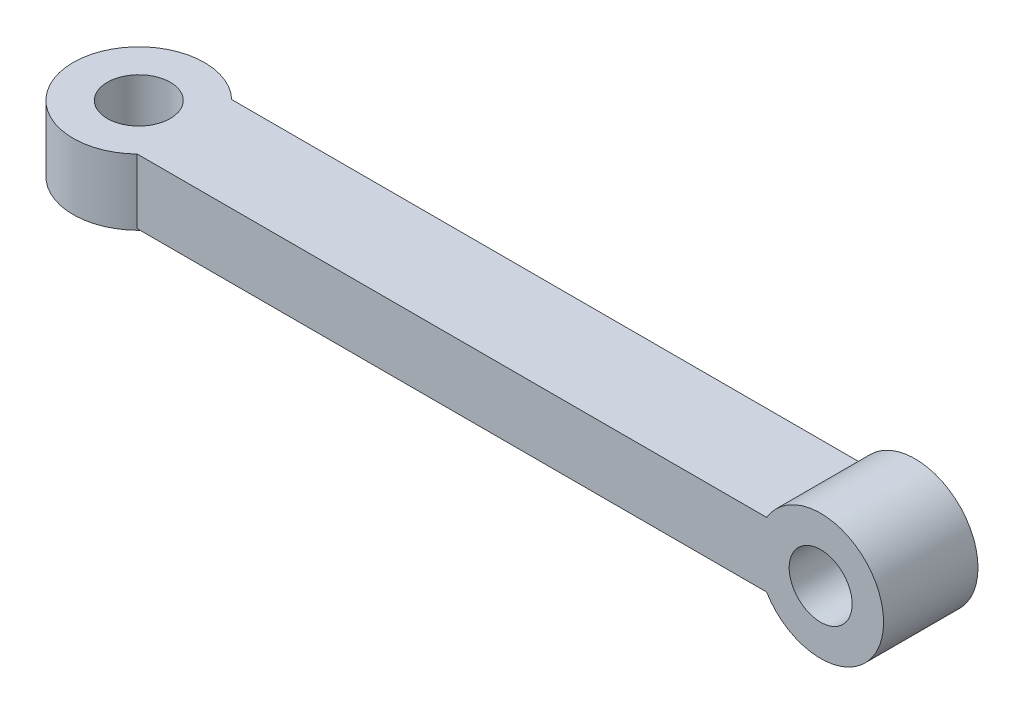
ISO-10303-21;
HEADER;
FILE_DESCRIPTION(('STEP AP214'),'2;1');
FILE_NAME('part.step','',(''),(''),'','','');
FILE_SCHEMA(('AUTOMOTIVE_DESIGN { 1 0 10303 214 1 1 1 1 }'));
ENDSEC;
DATA;
#1=APPLICATION_CONTEXT('core data for automotive mechanical design processes');
#2=APPLICATION_PROTOCOL_DEFINITION('international standard','automotive_design',2000,#1);
#3=PRODUCT_CONTEXT('',#1,'mechanical');
#4=PRODUCT('Part','Part','',(#3));
#5=PRODUCT_RELATED_PRODUCT_CATEGORY('part','',(#4));
#6=PRODUCT_DEFINITION_FORMATION('','',#4);
#7=PRODUCT_DEFINITION_CONTEXT('part definition',#1,'design');
#8=PRODUCT_DEFINITION('design','',#6,#7);
#9=PRODUCT_DEFINITION_SHAPE('','',#8);
#10=(LENGTH_UNIT() NAMED_UNIT(*) SI_UNIT(.MILLI.,.METRE.));
#11=(NAMED_UNIT(*) PLANE_ANGLE_UNIT() SI_UNIT($,.RADIAN.));
#12=(NAMED_UNIT(*) SI_UNIT($,.STERADIAN.) SOLID_ANGLE_UNIT());
#13=UNCERTAINTY_MEASURE_WITH_UNIT(LENGTH_MEASURE(1.E-05),#10,'distance_accuracy_value','');
#14=(GEOMETRIC_REPRESENTATION_CONTEXT(3) GLOBAL_UNCERTAINTY_ASSIGNED_CONTEXT((#13)) GLOBAL_UNIT_ASSIGNED_CONTEXT((#10,
#11,#12)) REPRESENTATION_CONTEXT('',''));
#15=CARTESIAN_POINT('',(0.,0.,0.));
#16=DIRECTION('',(0.,0.,1.));
#17=DIRECTION('',(1.,0.,0.));
#18=AXIS2_PLACEMENT_3D('',#15,#16,#17);
#19=CARTESIAN_POINT('',(110.269891460878,-2.00989612758394,15.));
#20=DIRECTION('',(0.,0.,-1.));
#21=DIRECTION('',(-1.,0.,0.));
#22=AXIS2_PLACEMENT_3D('',#19,#20,#21);
#23=PLANE('',#22);
#24=CARTESIAN_POINT('',(110.269891460878,-2.00989612758394,15.));
#25=DIRECTION('',(0.,0.,1.));
#26=DIRECTION('',(-1.,0.,0.));
#27=AXIS2_PLACEMENT_3D('',#24,#25,#26);
#28=CIRCLE('',#27,9.99999999999999);
#29=CARTESIAN_POINT('',(101.689180825993,-7.14520575801294,15.));
#30=VERTEX_POINT('',#29);
#31=CARTESIAN_POINT('',(101.689180825993,3.12541350284507,15.));
#32=VERTEX_POINT('',#31);
#33=EDGE_CURVE('E76',#30,#32,#28,.T.);
#34=ORIENTED_EDGE('',*,*,#33,.T.);
#35=DIRECTION('',(-1.,0.,0.));
#36=VECTOR('',#35,1.);
#37=CARTESIAN_POINT('',(101.689180825993,3.12541350284507,15.));
#38=LINE('',#37,#36);
#39=CARTESIAN_POINT('',(1.68918082599326,3.12541350284506,15.));
#40=VERTEX_POINT('',#39);
#41=EDGE_CURVE('E103',#32,#40,#38,.T.);
#42=ORIENTED_EDGE('',*,*,#41,.T.);
#43=DIRECTION('',(0.,-1.,0.));
#44=VECTOR('',#43,1.);
#45=CARTESIAN_POINT('',(1.68918082599326,-7.14520575801296,15.));
#46=LINE('',#45,#44);
#47=CARTESIAN_POINT('',(1.68918082599326,-7.14520575801296,15.));
#48=VERTEX_POINT('',#47);
#49=EDGE_CURVE('E106',#40,#48,#46,.T.);
#50=ORIENTED_EDGE('',*,*,#49,.T.);
#51=DIRECTION('',(1.,0.,0.));
#52=VECTOR('',#51,1.);
#53=CARTESIAN_POINT('',(101.689180825993,-7.14520575801294,15.));
#54=LINE('',#53,#52);
#55=EDGE_CURVE('E50',#48,#30,#54,.T.);
#56=ORIENTED_EDGE('',*,*,#55,.T.);
#57=EDGE_LOOP('',(#34,#42,#50,#56));
#58=FACE_BOUND('',#57,.T.);
#59=CARTESIAN_POINT('',(110.269891460878,-2.00989612758394,15.));
#60=DIRECTION('',(0.,0.,1.));
#61=DIRECTION('',(1.,0.,0.));
#62=AXIS2_PLACEMENT_3D('',#59,#60,#61);
#63=CIRCLE('',#62,5.);
#64=CARTESIAN_POINT('',(115.269891460878,-2.00989612758394,15.));
#65=VERTEX_POINT('',#64);
#66=EDGE_CURVE('E88',#65,#65,#63,.T.);
#67=ORIENTED_EDGE('',*,*,#66,.F.);
#68=EDGE_LOOP('',(#67));
#69=FACE_BOUND('',#68,.T.);
#70=ADVANCED_FACE('F33',(#58,#69),#23,.F.);
#71=CARTESIAN_POINT('',(110.269891460878,-2.00989612758394,0.));
#72=DIRECTION('',(0.,0.,-1.));
#73=DIRECTION('',(-1.,0.,0.));
#74=AXIS2_PLACEMENT_3D('',#71,#72,#73);
#75=PLANE('',#74);
#76=CARTESIAN_POINT('',(110.269891460878,-2.00989612758394,0.));
#77=DIRECTION('',(0.,0.,1.));
#78=DIRECTION('',(-1.,0.,0.));
#79=AXIS2_PLACEMENT_3D('',#76,#77,#78);
#80=CIRCLE('',#79,9.99999999999999);
#81=CARTESIAN_POINT('',(101.689180825993,-7.14520575801294,0.));
#82=VERTEX_POINT('',#81);
#83=CARTESIAN_POINT('',(101.689180825993,3.12541350284507,0.));
#84=VERTEX_POINT('',#83);
#85=EDGE_CURVE('E81',#82,#84,#80,.T.);
#86=ORIENTED_EDGE('',*,*,#85,.F.);
#87=DIRECTION('',(1.,0.,0.));
#88=VECTOR('',#87,1.);
#89=CARTESIAN_POINT('',(101.689180825993,-7.14520575801294,0.));
#90=LINE('',#89,#88);
#91=CARTESIAN_POINT('',(1.68918082599326,-7.14520575801296,0.));
#92=VERTEX_POINT('',#91);
#93=EDGE_CURVE('E69',#92,#82,#90,.T.);
#94=ORIENTED_EDGE('',*,*,#93,.F.);
#95=DIRECTION('',(0.,-1.,0.));
#96=VECTOR('',#95,1.);
#97=CARTESIAN_POINT('',(1.68918082599326,-7.14520575801296,0.));
#98=LINE('',#97,#96);
#99=CARTESIAN_POINT('',(1.68918082599326,3.12541350284506,0.));
#100=VERTEX_POINT('',#99);
#101=EDGE_CURVE('E65',#100,#92,#98,.T.);
#102=ORIENTED_EDGE('',*,*,#101,.F.);
#103=DIRECTION('',(-1.,0.,0.));
#104=VECTOR('',#103,1.);
#105=CARTESIAN_POINT('',(101.689180825993,3.12541350284507,0.));
#106=LINE('',#105,#104);
#107=EDGE_CURVE('E86',#84,#100,#106,.T.);
#108=ORIENTED_EDGE('',*,*,#107,.F.);
#109=EDGE_LOOP('',(#86,#94,#102,#108));
#110=FACE_BOUND('',#109,.T.);
#111=CARTESIAN_POINT('',(110.269891460878,-2.00989612758394,0.));
#112=DIRECTION('',(0.,0.,1.));
#113=DIRECTION('',(1.,0.,0.));
#114=AXIS2_PLACEMENT_3D('',#111,#112,#113);
#115=CIRCLE('',#114,5.);
#116=CARTESIAN_POINT('',(115.269891460878,-2.00989612758394,0.));
#117=VERTEX_POINT('',#116);
#118=EDGE_CURVE('E92',#117,#117,#115,.T.);
#119=ORIENTED_EDGE('',*,*,#118,.T.);
#120=EDGE_LOOP('',(#119));
#121=FACE_BOUND('',#120,.T.);
#122=ADVANCED_FACE('F83',(#110,#121),#75,.T.);
#123=CARTESIAN_POINT('',(110.269891460878,-2.00989612758394,15.));
#124=DIRECTION('',(0.,0.,-1.));
#125=DIRECTION('',(-1.,0.,0.));
#126=AXIS2_PLACEMENT_3D('',#123,#124,#125);
#127=CYLINDRICAL_SURFACE('',#126,9.99999999999999);
#128=ORIENTED_EDGE('',*,*,#85,.T.);
#129=DIRECTION('',(0.,0.,-1.));
#130=VECTOR('',#129,1.);
#131=CARTESIAN_POINT('',(101.689180825993,3.12541350284507,15.));
#132=LINE('',#131,#130);
#133=EDGE_CURVE('E42',#32,#84,#132,.T.);
#134=ORIENTED_EDGE('',*,*,#133,.F.);
#135=ORIENTED_EDGE('',*,*,#33,.F.);
#136=DIRECTION('',(0.,0.,-1.));
#137=VECTOR('',#136,1.);
#138=CARTESIAN_POINT('',(101.689180825993,-7.14520575801294,15.));
#139=LINE('',#138,#137);
#140=EDGE_CURVE('E72',#30,#82,#139,.T.);
#141=ORIENTED_EDGE('',*,*,#140,.T.);
#142=EDGE_LOOP('',(#128,#134,#135,#141));
#143=FACE_BOUND('',#142,.T.);
#144=ADVANCED_FACE('F35',(#143),#127,.T.);
#145=CARTESIAN_POINT('',(101.689180825993,3.12541350284507,15.));
#146=DIRECTION('',(0.,-1.,0.));
#147=DIRECTION('',(1.,0.,0.));
#148=AXIS2_PLACEMENT_3D('',#145,#146,#147);
#149=PLANE('',#148);
#150=ORIENTED_EDGE('',*,*,#107,.T.);
#151=CARTESIAN_POINT('',(-5.56603551678272,3.12541350284506,7.5));
#152=DIRECTION('',(0.,1.,0.));
#153=DIRECTION('',(-1.,0.,0.));
#154=AXIS2_PLACEMENT_3D('',#151,#152,#153);
#155=CIRCLE('',#154,10.43494917);
#156=EDGE_CURVE('E105',#100,#40,#155,.T.);
#157=ORIENTED_EDGE('',*,*,#156,.T.);
#158=ORIENTED_EDGE('',*,*,#41,.F.);
#159=ORIENTED_EDGE('',*,*,#133,.T.);
#160=EDGE_LOOP('',(#150,#157,#158,#159));
#161=FACE_BOUND('',#160,.T.);
#162=CARTESIAN_POINT('',(-5.56603551678272,3.12541350284506,7.5));
#163=DIRECTION('',(0.,1.,0.));
#164=DIRECTION('',(-1.,0.,0.));
#165=AXIS2_PLACEMENT_3D('',#162,#163,#164);
#166=CIRCLE('',#165,5.);
#167=CARTESIAN_POINT('',(-10.5660355167827,3.12541350284506,7.5));
#168=VERTEX_POINT('',#167);
#169=EDGE_CURVE('E121',#168,#168,#166,.T.);
#170=ORIENTED_EDGE('',*,*,#169,.F.);
#171=EDGE_LOOP('',(#170));
#172=FACE_BOUND('',#171,.T.);
#173=ADVANCED_FACE('F98',(#161,#172),#149,.F.);
#174=CARTESIAN_POINT('',(101.689180825993,-7.14520575801294,15.));
#175=DIRECTION('',(0.,1.,0.));
#176=DIRECTION('',(-1.,0.,0.));
#177=AXIS2_PLACEMENT_3D('',#174,#175,#176);
#178=PLANE('',#177);
#179=ORIENTED_EDGE('',*,*,#55,.F.);
#180=CARTESIAN_POINT('',(-5.56603551678272,-7.14520575801296,7.5));
#181=DIRECTION('',(0.,1.,0.));
#182=DIRECTION('',(-1.,0.,0.));
#183=AXIS2_PLACEMENT_3D('',#180,#181,#182);
#184=CIRCLE('',#183,10.43494917);
#185=EDGE_CURVE('E11',#48,#92,#184,.T.);
#186=ORIENTED_EDGE('',*,*,#185,.T.);
#187=ORIENTED_EDGE('',*,*,#93,.T.);
#188=ORIENTED_EDGE('',*,*,#140,.F.);
#189=EDGE_LOOP('',(#179,#186,#187,#188));
#190=FACE_BOUND('',#189,.T.);
#191=ADVANCED_FACE('F71',(#190),#178,.F.);
#192=CARTESIAN_POINT('',(110.269891460878,-2.00989612758394,15.));
#193=DIRECTION('',(0.,0.,-1.));
#194=DIRECTION('',(-1.,0.,0.));
#195=AXIS2_PLACEMENT_3D('',#192,#193,#194);
#196=CYLINDRICAL_SURFACE('',#195,5.);
#197=ORIENTED_EDGE('',*,*,#66,.T.);
#198=EDGE_LOOP('',(#197));
#199=FACE_BOUND('',#198,.T.);
#200=ORIENTED_EDGE('',*,*,#118,.F.);
#201=EDGE_LOOP('',(#200));
#202=FACE_BOUND('',#201,.T.);
#203=ADVANCED_FACE('F133',(#199,#202),#196,.F.);
#204=CARTESIAN_POINT('',(-5.56603551678272,-7.37458649715494,7.5));
#205=DIRECTION('',(0.,1.,0.));
#206=DIRECTION('',(-1.,0.,0.));
#207=AXIS2_PLACEMENT_3D('',#204,#205,#206);
#208=CYLINDRICAL_SURFACE('',#207,10.43494917);
#209=CARTESIAN_POINT('',(-5.56603551678272,-7.37458649715494,7.5));
#210=DIRECTION('',(0.,1.,0.));
#211=DIRECTION('',(-1.,0.,0.));
#212=AXIS2_PLACEMENT_3D('',#209,#210,#211);
#213=CIRCLE('',#212,10.43494917);
#214=CARTESIAN_POINT('',(-16.0009846867827,-7.37458649715494,7.5));
#215=VERTEX_POINT('',#214);
#216=EDGE_CURVE('E115',#215,#215,#213,.T.);
#217=ORIENTED_EDGE('',*,*,#216,.T.);
#218=EDGE_LOOP('',(#217));
#219=FACE_BOUND('',#218,.T.);
#220=ORIENTED_EDGE('',*,*,#101,.T.);
#221=ORIENTED_EDGE('',*,*,#185,.F.);
#222=ORIENTED_EDGE('',*,*,#49,.F.);
#223=ORIENTED_EDGE('',*,*,#156,.F.);
#224=EDGE_LOOP('',(#220,#221,#222,#223));
#225=FACE_BOUND('',#224,.T.);
#226=ADVANCED_FACE('F112',(#219,#225),#208,.T.);
#227=CARTESIAN_POINT('',(-5.56603551678272,-7.37458649715494,7.5));
#228=DIRECTION('',(0.,1.,0.));
#229=DIRECTION('',(-1.,0.,0.));
#230=AXIS2_PLACEMENT_3D('',#227,#228,#229);
#231=PLANE('',#230);
#232=CARTESIAN_POINT('',(-5.56603551678272,-7.37458649715494,7.5));
#233=DIRECTION('',(0.,1.,0.));
#234=DIRECTION('',(-1.,0.,0.));
#235=AXIS2_PLACEMENT_3D('',#232,#233,#234);
#236=CIRCLE('',#235,5.);
#237=CARTESIAN_POINT('',(-10.5660355167827,-7.37458649715494,7.5));
#238=VERTEX_POINT('',#237);
#239=EDGE_CURVE('E116',#238,#238,#236,.T.);
#240=ORIENTED_EDGE('',*,*,#239,.T.);
#241=EDGE_LOOP('',(#240));
#242=FACE_BOUND('',#241,.T.);
#243=ORIENTED_EDGE('',*,*,#216,.F.);
#244=EDGE_LOOP('',(#243));
#245=FACE_BOUND('',#244,.T.);
#246=ADVANCED_FACE('F147',(#242,#245),#231,.F.);
#247=CARTESIAN_POINT('',(-5.56603551678272,-7.37458649715494,7.5));
#248=DIRECTION('',(0.,1.,0.));
#249=DIRECTION('',(-1.,0.,0.));
#250=AXIS2_PLACEMENT_3D('',#247,#248,#249);
#251=CYLINDRICAL_SURFACE('',#250,5.);
#252=CARTESIAN_POINT('',(-10.5660355167827,-7.37458649715494,7.5));
#253=CARTESIAN_POINT('',(-10.5660355167827,-7.26521149715494,7.5));
#254=CARTESIAN_POINT('',(-10.5660355167827,-7.15583649715494,7.5));
#255=CARTESIAN_POINT('',(-10.5660355167827,-6.93708649715494,7.5));
#256=CARTESIAN_POINT('',(-10.5660355167827,-6.82771149715494,7.5));
#257=CARTESIAN_POINT('',(-10.5660355167827,-6.60896149715494,7.5));
#258=CARTESIAN_POINT('',(-10.5660355167827,-6.49958649715494,7.5));
#259=CARTESIAN_POINT('',(-10.5660355167827,-6.28083649715494,7.5));
#260=CARTESIAN_POINT('',(-10.5660355167827,-6.17146149715494,7.5));
#261=CARTESIAN_POINT('',(-10.5660355167827,-5.95271149715494,7.5));
#262=CARTESIAN_POINT('',(-10.5660355167827,-5.84333649715494,7.5));
#263=CARTESIAN_POINT('',(-10.5660355167827,-5.62458649715494,7.5));
#264=CARTESIAN_POINT('',(-10.5660355167827,-5.51521149715494,7.5));
#265=CARTESIAN_POINT('',(-10.5660355167827,-5.29646149715494,7.5));
#266=CARTESIAN_POINT('',(-10.5660355167827,-5.18708649715494,7.5));
#267=CARTESIAN_POINT('',(-10.5660355167827,-4.96833649715494,7.5));
#268=CARTESIAN_POINT('',(-10.5660355167827,-4.85896149715494,7.5));
#269=CARTESIAN_POINT('',(-10.5660355167827,-4.64021149715494,7.5));
#270=CARTESIAN_POINT('',(-10.5660355167827,-4.53083649715494,7.5));
#271=CARTESIAN_POINT('',(-10.5660355167827,-4.31208649715494,7.5));
#272=CARTESIAN_POINT('',(-10.5660355167827,-4.20271149715494,7.5));
#273=CARTESIAN_POINT('',(-10.5660355167827,-3.98396149715494,7.5));
#274=CARTESIAN_POINT('',(-10.5660355167827,-3.87458649715494,7.5));
#275=CARTESIAN_POINT('',(-10.5660355167827,-3.65583649715494,7.5));
#276=CARTESIAN_POINT('',(-10.5660355167827,-3.54646149715494,7.5));
#277=CARTESIAN_POINT('',(-10.5660355167827,-3.32771149715494,7.5));
#278=CARTESIAN_POINT('',(-10.5660355167827,-3.21833649715494,7.5));
#279=CARTESIAN_POINT('',(-10.5660355167827,-2.99958649715494,7.5));
#280=CARTESIAN_POINT('',(-10.5660355167827,-2.89021149715494,7.5));
#281=CARTESIAN_POINT('',(-10.5660355167827,-2.67146149715494,7.5));
#282=CARTESIAN_POINT('',(-10.5660355167827,-2.56208649715494,7.5));
#283=CARTESIAN_POINT('',(-10.5660355167827,-2.34333649715494,7.5));
#284=CARTESIAN_POINT('',(-10.5660355167827,-2.23396149715494,7.5));
#285=CARTESIAN_POINT('',(-10.5660355167827,-2.01521149715494,7.5));
#286=CARTESIAN_POINT('',(-10.5660355167827,-1.90583649715494,7.5));
#287=CARTESIAN_POINT('',(-10.5660355167827,-1.68708649715494,7.5));
#288=CARTESIAN_POINT('',(-10.5660355167827,-1.57771149715494,7.5));
#289=CARTESIAN_POINT('',(-10.5660355167827,-1.35896149715494,7.5));
#290=CARTESIAN_POINT('',(-10.5660355167827,-1.24958649715494,7.5));
#291=CARTESIAN_POINT('',(-10.5660355167827,-1.03083649715494,7.5));
#292=CARTESIAN_POINT('',(-10.5660355167827,-0.921461497154942,7.5));
#293=CARTESIAN_POINT('',(-10.5660355167827,-0.702711497154942,7.5));
#294=CARTESIAN_POINT('',(-10.5660355167827,-0.593336497154942,7.5));
#295=CARTESIAN_POINT('',(-10.5660355167827,-0.374586497154942,7.5));
#296=CARTESIAN_POINT('',(-10.5660355167827,-0.265211497154942,7.5));
#297=CARTESIAN_POINT('',(-10.5660355167827,-0.0464614971549425,7.5));
#298=CARTESIAN_POINT('',(-10.5660355167827,0.0629135028450576,7.5));
#299=CARTESIAN_POINT('',(-10.5660355167827,0.281663502845058,7.5));
#300=CARTESIAN_POINT('',(-10.5660355167827,0.391038502845057,7.5));
#301=CARTESIAN_POINT('',(-10.5660355167827,0.609788502845057,7.5));
#302=CARTESIAN_POINT('',(-10.5660355167827,0.719163502845057,7.5));
#303=CARTESIAN_POINT('',(-10.5660355167827,0.937913502845058,7.5));
#304=CARTESIAN_POINT('',(-10.5660355167827,1.04728850284506,7.5));
#305=CARTESIAN_POINT('',(-10.5660355167827,1.26603850284506,7.5));
#306=CARTESIAN_POINT('',(-10.5660355167827,1.37541350284506,7.5));
#307=CARTESIAN_POINT('',(-10.5660355167827,1.59416350284506,7.5));
#308=CARTESIAN_POINT('',(-10.5660355167827,1.70353850284506,7.5));
#309=CARTESIAN_POINT('',(-10.5660355167827,1.92228850284506,7.5));
#310=CARTESIAN_POINT('',(-10.5660355167827,2.03166350284506,7.5));
#311=CARTESIAN_POINT('',(-10.5660355167827,2.25041350284506,7.5));
#312=CARTESIAN_POINT('',(-10.5660355167827,2.35978850284506,7.5));
#313=CARTESIAN_POINT('',(-10.5660355167827,2.57853850284506,7.5));
#314=CARTESIAN_POINT('',(-10.5660355167827,2.68791350284506,7.5));
#315=CARTESIAN_POINT('',(-10.5660355167827,2.90666350284506,7.5));
#316=CARTESIAN_POINT('',(-10.5660355167827,3.01603850284506,7.5));
#317=CARTESIAN_POINT('',(-10.5660355167827,3.12541350284506,7.5));
#318=B_SPLINE_CURVE_WITH_KNOTS('',3,(#252,#253,#254,#255,#256,#257,#258,#259,#260,#261,#262,
#263,#264,#265,#266,#267,#268,#269,#270,#271,#272,#273,#274,#275,#276,#277,#278,#279,#280,#281,
#282,#283,#284,#285,#286,#287,#288,#289,#290,#291,#292,#293,#294,#295,#296,#297,#298,#299,#300,
#301,#302,#303,#304,#305,#306,#307,#308,#309,#310,#311,#312,#313,#314,#315,#316,#317),
.UNSPECIFIED.,.F.,.F.,(4,2,2,2,2,2,2,2,2,2,2,2,2,2,2,2,2,2,2,2,2,2,2,2,2,2,2,2,2,2,2,2,4),(0.,
0.328125,0.656250000000001,0.984375000000001,1.3125,1.640625,1.96875,2.296875,2.625,2.953125,
3.28125,3.609375,3.9375,4.265625,4.59375,4.921875,5.25,5.578125,5.90625,6.234375,6.5625,
6.890625,7.21875,7.546875,7.875,8.203125,8.53125,8.859375,9.1875,9.515625,9.84375,10.171875,
10.5),.UNSPECIFIED.);
#319=EDGE_CURVE('BSEAM127',#238,#168,#318,.T.);
#320=ORIENTED_EDGE('',*,*,#239,.F.);
#321=ORIENTED_EDGE('',*,*,#169,.T.);
#322=ORIENTED_EDGE('',*,*,#319,.T.);
#323=ORIENTED_EDGE('',*,*,#319,.F.);
#324=EDGE_LOOP('',(#320,#322,#321,#323));
#325=FACE_BOUND('',#324,.T.);
#326=ADVANCED_FACE('F127',(#325),#251,.F.);
#327=CLOSED_SHELL('',(#70,#122,#144,#173,#191,#203,#226,#246,#326));
#328=MANIFOLD_SOLID_BREP('B2',#327);
#329=ADVANCED_BREP_SHAPE_REPRESENTATION('',(#18,#328),#14);
#330=SHAPE_DEFINITION_REPRESENTATION(#9,#329);
ENDSEC;
END-ISO-10303-21;
